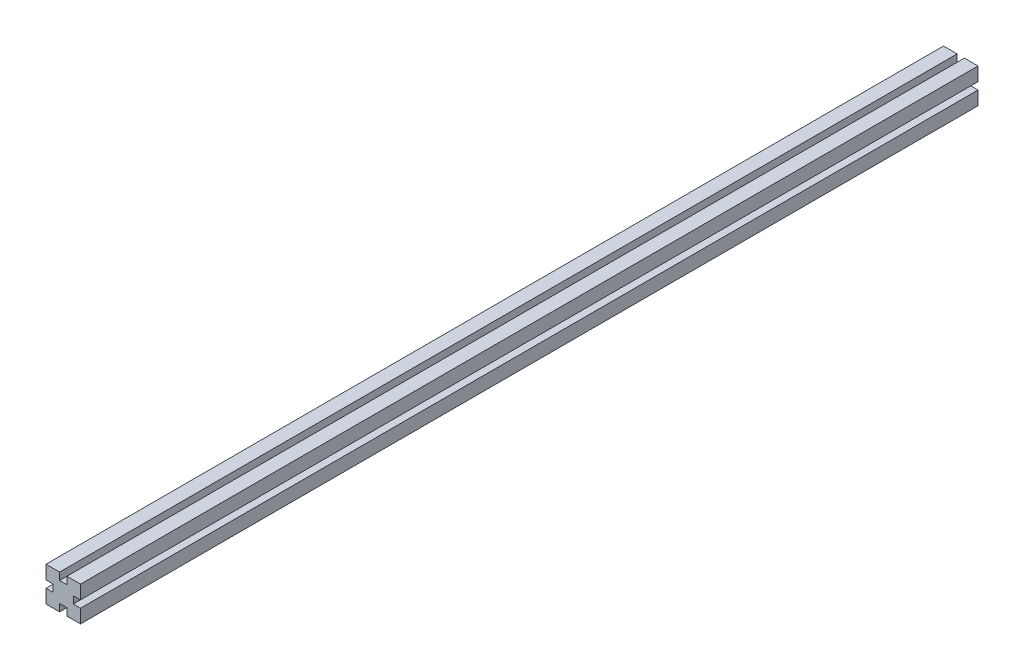
ISO-10303-21;
HEADER;
FILE_DESCRIPTION(('STEP AP214'),'2;1');
FILE_NAME('part.step','',(''),(''),'','','');
FILE_SCHEMA(('AUTOMOTIVE_DESIGN { 1 0 10303 214 1 1 1 1 }'));
ENDSEC;
DATA;
#1=APPLICATION_CONTEXT('core data for automotive mechanical design processes');
#2=APPLICATION_PROTOCOL_DEFINITION('international standard','automotive_design',2000,#1);
#3=PRODUCT_CONTEXT('',#1,'mechanical');
#4=PRODUCT('Part','Part','',(#3));
#5=PRODUCT_RELATED_PRODUCT_CATEGORY('part','',(#4));
#6=PRODUCT_DEFINITION_FORMATION('','',#4);
#7=PRODUCT_DEFINITION_CONTEXT('part definition',#1,'design');
#8=PRODUCT_DEFINITION('design','',#6,#7);
#9=PRODUCT_DEFINITION_SHAPE('','',#8);
#10=(LENGTH_UNIT() NAMED_UNIT(*) SI_UNIT(.MILLI.,.METRE.));
#11=(NAMED_UNIT(*) PLANE_ANGLE_UNIT() SI_UNIT($,.RADIAN.));
#12=(NAMED_UNIT(*) SI_UNIT($,.STERADIAN.) SOLID_ANGLE_UNIT());
#13=UNCERTAINTY_MEASURE_WITH_UNIT(LENGTH_MEASURE(1.E-05),#10,'distance_accuracy_value','');
#14=(GEOMETRIC_REPRESENTATION_CONTEXT(3) GLOBAL_UNCERTAINTY_ASSIGNED_CONTEXT((#13)) GLOBAL_UNIT_ASSIGNED_CONTEXT((#10,
#11,#12)) REPRESENTATION_CONTEXT('',''));
#15=CARTESIAN_POINT('',(0.,0.,0.));
#16=DIRECTION('',(0.,0.,1.));
#17=DIRECTION('',(1.,0.,0.));
#18=AXIS2_PLACEMENT_3D('',#15,#16,#17);
#19=CARTESIAN_POINT('',(-19.05,-4.,991.11));
#20=DIRECTION('',(1.,0.,0.));
#21=DIRECTION('',(0.,0.,-1.));
#22=AXIS2_PLACEMENT_3D('',#19,#20,#21);
#23=PLANE('',#22);
#24=DIRECTION('',(0.,-1.,0.));
#25=VECTOR('',#24,1.);
#26=CARTESIAN_POINT('',(-19.05,-4.,0.));
#27=LINE('',#26,#25);
#28=CARTESIAN_POINT('',(-19.05,-4.,0.));
#29=VERTEX_POINT('',#28);
#30=CARTESIAN_POINT('',(-19.05,-19.05,0.));
#31=VERTEX_POINT('',#30);
#32=EDGE_CURVE('E207',#29,#31,#27,.T.);
#33=ORIENTED_EDGE('',*,*,#32,.T.);
#34=DIRECTION('',(0.,0.,-1.));
#35=VECTOR('',#34,1.);
#36=CARTESIAN_POINT('',(-19.05,-19.05,991.11));
#37=LINE('',#36,#35);
#38=CARTESIAN_POINT('',(-19.05,-19.05,991.11));
#39=VERTEX_POINT('',#38);
#40=EDGE_CURVE('E11',#39,#31,#37,.T.);
#41=ORIENTED_EDGE('',*,*,#40,.F.);
#42=DIRECTION('',(0.,-1.,0.));
#43=VECTOR('',#42,1.);
#44=CARTESIAN_POINT('',(-19.05,-4.,991.11));
#45=LINE('',#44,#43);
#46=CARTESIAN_POINT('',(-19.05,-4.,991.11));
#47=VERTEX_POINT('',#46);
#48=EDGE_CURVE('E245',#47,#39,#45,.T.);
#49=ORIENTED_EDGE('',*,*,#48,.F.);
#50=DIRECTION('',(0.,0.,-1.));
#51=VECTOR('',#50,1.);
#52=CARTESIAN_POINT('',(-19.05,-4.,991.11));
#53=LINE('',#52,#51);
#54=EDGE_CURVE('E203',#47,#29,#53,.T.);
#55=ORIENTED_EDGE('',*,*,#54,.T.);
#56=EDGE_LOOP('',(#33,#41,#49,#55));
#57=FACE_BOUND('',#56,.T.);
#58=ADVANCED_FACE('F39',(#57),#23,.F.);
#59=CARTESIAN_POINT('',(-19.05,-19.05,991.11));
#60=DIRECTION('',(0.,1.,0.));
#61=DIRECTION('',(0.,0.,1.));
#62=AXIS2_PLACEMENT_3D('',#59,#60,#61);
#63=PLANE('',#62);
#64=DIRECTION('',(1.,0.,0.));
#65=VECTOR('',#64,1.);
#66=CARTESIAN_POINT('',(-19.05,-19.05,0.));
#67=LINE('',#66,#65);
#68=CARTESIAN_POINT('',(-4.,-19.05,0.));
#69=VERTEX_POINT('',#68);
#70=EDGE_CURVE('E210',#31,#69,#67,.T.);
#71=ORIENTED_EDGE('',*,*,#70,.T.);
#72=DIRECTION('',(0.,0.,-1.));
#73=VECTOR('',#72,1.);
#74=CARTESIAN_POINT('',(-4.,-19.05,991.11));
#75=LINE('',#74,#73);
#76=CARTESIAN_POINT('',(-4.,-19.05,991.11));
#77=VERTEX_POINT('',#76);
#78=EDGE_CURVE('E47',#77,#69,#75,.T.);
#79=ORIENTED_EDGE('',*,*,#78,.F.);
#80=DIRECTION('',(1.,0.,0.));
#81=VECTOR('',#80,1.);
#82=CARTESIAN_POINT('',(-19.05,-19.05,991.11));
#83=LINE('',#82,#81);
#84=EDGE_CURVE('E134',#39,#77,#83,.T.);
#85=ORIENTED_EDGE('',*,*,#84,.F.);
#86=ORIENTED_EDGE('',*,*,#40,.T.);
#87=EDGE_LOOP('',(#71,#79,#85,#86));
#88=FACE_BOUND('',#87,.T.);
#89=ADVANCED_FACE('F363',(#88),#63,.F.);
#90=CARTESIAN_POINT('',(-4.,-19.05,991.11));
#91=DIRECTION('',(-1.,0.,0.));
#92=DIRECTION('',(0.,0.,1.));
#93=AXIS2_PLACEMENT_3D('',#90,#91,#92);
#94=PLANE('',#93);
#95=DIRECTION('',(0.,1.,0.));
#96=VECTOR('',#95,1.);
#97=CARTESIAN_POINT('',(-4.,-19.05,0.));
#98=LINE('',#97,#96);
#99=CARTESIAN_POINT('',(-4.,-11.05,0.));
#100=VERTEX_POINT('',#99);
#101=EDGE_CURVE('E212',#69,#100,#98,.T.);
#102=ORIENTED_EDGE('',*,*,#101,.T.);
#103=DIRECTION('',(0.,0.,-1.));
#104=VECTOR('',#103,1.);
#105=CARTESIAN_POINT('',(-4.,-11.05,991.11));
#106=LINE('',#105,#104);
#107=CARTESIAN_POINT('',(-4.,-11.05,991.11));
#108=VERTEX_POINT('',#107);
#109=EDGE_CURVE('E288',#108,#100,#106,.T.);
#110=ORIENTED_EDGE('',*,*,#109,.F.);
#111=DIRECTION('',(0.,1.,0.));
#112=VECTOR('',#111,1.);
#113=CARTESIAN_POINT('',(-4.,-19.05,991.11));
#114=LINE('',#113,#112);
#115=EDGE_CURVE('E296',#77,#108,#114,.T.);
#116=ORIENTED_EDGE('',*,*,#115,.F.);
#117=ORIENTED_EDGE('',*,*,#78,.T.);
#118=EDGE_LOOP('',(#102,#110,#116,#117));
#119=FACE_BOUND('',#118,.T.);
#120=ADVANCED_FACE('F294',(#119),#94,.F.);
#121=CARTESIAN_POINT('',(-4.,-11.05,991.11));
#122=DIRECTION('',(0.,1.,0.));
#123=DIRECTION('',(0.,0.,1.));
#124=AXIS2_PLACEMENT_3D('',#121,#122,#123);
#125=PLANE('',#124);
#126=DIRECTION('',(1.,0.,0.));
#127=VECTOR('',#126,1.);
#128=CARTESIAN_POINT('',(-4.,-11.05,0.));
#129=LINE('',#128,#127);
#130=CARTESIAN_POINT('',(4.,-11.05,0.));
#131=VERTEX_POINT('',#130);
#132=EDGE_CURVE('E214',#100,#131,#129,.T.);
#133=ORIENTED_EDGE('',*,*,#132,.T.);
#134=DIRECTION('',(0.,0.,-1.));
#135=VECTOR('',#134,1.);
#136=CARTESIAN_POINT('',(4.,-11.05,991.11));
#137=LINE('',#136,#135);
#138=CARTESIAN_POINT('',(4.,-11.05,991.11));
#139=VERTEX_POINT('',#138);
#140=EDGE_CURVE('E285',#139,#131,#137,.T.);
#141=ORIENTED_EDGE('',*,*,#140,.F.);
#142=DIRECTION('',(1.,0.,0.));
#143=VECTOR('',#142,1.);
#144=CARTESIAN_POINT('',(-4.,-11.05,991.11));
#145=LINE('',#144,#143);
#146=EDGE_CURVE('E314',#108,#139,#145,.T.);
#147=ORIENTED_EDGE('',*,*,#146,.F.);
#148=ORIENTED_EDGE('',*,*,#109,.T.);
#149=EDGE_LOOP('',(#133,#141,#147,#148));
#150=FACE_BOUND('',#149,.T.);
#151=ADVANCED_FACE('F305',(#150),#125,.F.);
#152=CARTESIAN_POINT('',(4.,-11.05,991.11));
#153=DIRECTION('',(1.,0.,0.));
#154=DIRECTION('',(0.,0.,-1.));
#155=AXIS2_PLACEMENT_3D('',#152,#153,#154);
#156=PLANE('',#155);
#157=DIRECTION('',(0.,-1.,0.));
#158=VECTOR('',#157,1.);
#159=CARTESIAN_POINT('',(4.,-11.05,0.));
#160=LINE('',#159,#158);
#161=CARTESIAN_POINT('',(4.,-19.05,0.));
#162=VERTEX_POINT('',#161);
#163=EDGE_CURVE('E216',#131,#162,#160,.T.);
#164=ORIENTED_EDGE('',*,*,#163,.T.);
#165=DIRECTION('',(0.,0.,-1.));
#166=VECTOR('',#165,1.);
#167=CARTESIAN_POINT('',(4.,-19.05,991.11));
#168=LINE('',#167,#166);
#169=CARTESIAN_POINT('',(4.,-19.05,991.11));
#170=VERTEX_POINT('',#169);
#171=EDGE_CURVE('E282',#170,#162,#168,.T.);
#172=ORIENTED_EDGE('',*,*,#171,.F.);
#173=DIRECTION('',(0.,-1.,0.));
#174=VECTOR('',#173,1.);
#175=CARTESIAN_POINT('',(4.,-11.05,991.11));
#176=LINE('',#175,#174);
#177=EDGE_CURVE('E311',#139,#170,#176,.T.);
#178=ORIENTED_EDGE('',*,*,#177,.F.);
#179=ORIENTED_EDGE('',*,*,#140,.T.);
#180=EDGE_LOOP('',(#164,#172,#178,#179));
#181=FACE_BOUND('',#180,.T.);
#182=ADVANCED_FACE('F309',(#181),#156,.F.);
#183=CARTESIAN_POINT('',(4.,-19.05,991.11));
#184=DIRECTION('',(0.,1.,0.));
#185=DIRECTION('',(0.,0.,1.));
#186=AXIS2_PLACEMENT_3D('',#183,#184,#185);
#187=PLANE('',#186);
#188=DIRECTION('',(1.,0.,0.));
#189=VECTOR('',#188,1.);
#190=CARTESIAN_POINT('',(4.,-19.05,0.));
#191=LINE('',#190,#189);
#192=CARTESIAN_POINT('',(19.05,-19.05,0.));
#193=VERTEX_POINT('',#192);
#194=EDGE_CURVE('E218',#162,#193,#191,.T.);
#195=ORIENTED_EDGE('',*,*,#194,.T.);
#196=DIRECTION('',(0.,0.,-1.));
#197=VECTOR('',#196,1.);
#198=CARTESIAN_POINT('',(19.05,-19.05,991.11));
#199=LINE('',#198,#197);
#200=CARTESIAN_POINT('',(19.05,-19.05,991.11));
#201=VERTEX_POINT('',#200);
#202=EDGE_CURVE('E279',#201,#193,#199,.T.);
#203=ORIENTED_EDGE('',*,*,#202,.F.);
#204=DIRECTION('',(1.,0.,0.));
#205=VECTOR('',#204,1.);
#206=CARTESIAN_POINT('',(4.,-19.05,991.11));
#207=LINE('',#206,#205);
#208=EDGE_CURVE('E313',#170,#201,#207,.T.);
#209=ORIENTED_EDGE('',*,*,#208,.F.);
#210=ORIENTED_EDGE('',*,*,#171,.T.);
#211=EDGE_LOOP('',(#195,#203,#209,#210));
#212=FACE_BOUND('',#211,.T.);
#213=ADVANCED_FACE('F376',(#212),#187,.F.);
#214=CARTESIAN_POINT('',(19.05,-19.05,991.11));
#215=DIRECTION('',(-1.,0.,0.));
#216=DIRECTION('',(0.,0.,1.));
#217=AXIS2_PLACEMENT_3D('',#214,#215,#216);
#218=PLANE('',#217);
#219=DIRECTION('',(0.,1.,0.));
#220=VECTOR('',#219,1.);
#221=CARTESIAN_POINT('',(19.05,-19.05,0.));
#222=LINE('',#221,#220);
#223=CARTESIAN_POINT('',(19.05,-4.,0.));
#224=VERTEX_POINT('',#223);
#225=EDGE_CURVE('E220',#193,#224,#222,.T.);
#226=ORIENTED_EDGE('',*,*,#225,.T.);
#227=DIRECTION('',(0.,0.,-1.));
#228=VECTOR('',#227,1.);
#229=CARTESIAN_POINT('',(19.05,-4.,991.11));
#230=LINE('',#229,#228);
#231=CARTESIAN_POINT('',(19.05,-4.,991.11));
#232=VERTEX_POINT('',#231);
#233=EDGE_CURVE('E276',#232,#224,#230,.T.);
#234=ORIENTED_EDGE('',*,*,#233,.F.);
#235=DIRECTION('',(0.,1.,0.));
#236=VECTOR('',#235,1.);
#237=CARTESIAN_POINT('',(19.05,-19.05,991.11));
#238=LINE('',#237,#236);
#239=EDGE_CURVE('E316',#201,#232,#238,.T.);
#240=ORIENTED_EDGE('',*,*,#239,.F.);
#241=ORIENTED_EDGE('',*,*,#202,.T.);
#242=EDGE_LOOP('',(#226,#234,#240,#241));
#243=FACE_BOUND('',#242,.T.);
#244=ADVANCED_FACE('F379',(#243),#218,.F.);
#245=CARTESIAN_POINT('',(19.05,-4.,991.11));
#246=DIRECTION('',(0.,-1.,0.));
#247=DIRECTION('',(0.,0.,-1.));
#248=AXIS2_PLACEMENT_3D('',#245,#246,#247);
#249=PLANE('',#248);
#250=DIRECTION('',(-1.,0.,0.));
#251=VECTOR('',#250,1.);
#252=CARTESIAN_POINT('',(19.05,-4.,0.));
#253=LINE('',#252,#251);
#254=CARTESIAN_POINT('',(11.05,-4.,0.));
#255=VERTEX_POINT('',#254);
#256=EDGE_CURVE('E222',#224,#255,#253,.T.);
#257=ORIENTED_EDGE('',*,*,#256,.T.);
#258=DIRECTION('',(0.,0.,-1.));
#259=VECTOR('',#258,1.);
#260=CARTESIAN_POINT('',(11.05,-4.,991.11));
#261=LINE('',#260,#259);
#262=CARTESIAN_POINT('',(11.05,-4.,991.11));
#263=VERTEX_POINT('',#262);
#264=EDGE_CURVE('E273',#263,#255,#261,.T.);
#265=ORIENTED_EDGE('',*,*,#264,.F.);
#266=DIRECTION('',(-1.,0.,0.));
#267=VECTOR('',#266,1.);
#268=CARTESIAN_POINT('',(19.05,-4.,991.11));
#269=LINE('',#268,#267);
#270=EDGE_CURVE('E322',#232,#263,#269,.T.);
#271=ORIENTED_EDGE('',*,*,#270,.F.);
#272=ORIENTED_EDGE('',*,*,#233,.T.);
#273=EDGE_LOOP('',(#257,#265,#271,#272));
#274=FACE_BOUND('',#273,.T.);
#275=ADVANCED_FACE('F383',(#274),#249,.F.);
#276=CARTESIAN_POINT('',(11.05,-4.,991.11));
#277=DIRECTION('',(-1.,0.,0.));
#278=DIRECTION('',(0.,0.,1.));
#279=AXIS2_PLACEMENT_3D('',#276,#277,#278);
#280=PLANE('',#279);
#281=DIRECTION('',(0.,1.,0.));
#282=VECTOR('',#281,1.);
#283=CARTESIAN_POINT('',(11.05,-4.,0.));
#284=LINE('',#283,#282);
#285=CARTESIAN_POINT('',(11.05,4.,0.));
#286=VERTEX_POINT('',#285);
#287=EDGE_CURVE('E224',#255,#286,#284,.T.);
#288=ORIENTED_EDGE('',*,*,#287,.T.);
#289=DIRECTION('',(0.,0.,-1.));
#290=VECTOR('',#289,1.);
#291=CARTESIAN_POINT('',(11.05,4.,991.11));
#292=LINE('',#291,#290);
#293=CARTESIAN_POINT('',(11.05,4.,991.11));
#294=VERTEX_POINT('',#293);
#295=EDGE_CURVE('E270',#294,#286,#292,.T.);
#296=ORIENTED_EDGE('',*,*,#295,.F.);
#297=DIRECTION('',(0.,1.,0.));
#298=VECTOR('',#297,1.);
#299=CARTESIAN_POINT('',(11.05,-4.,991.11));
#300=LINE('',#299,#298);
#301=EDGE_CURVE('E324',#263,#294,#300,.T.);
#302=ORIENTED_EDGE('',*,*,#301,.F.);
#303=ORIENTED_EDGE('',*,*,#264,.T.);
#304=EDGE_LOOP('',(#288,#296,#302,#303));
#305=FACE_BOUND('',#304,.T.);
#306=ADVANCED_FACE('F387',(#305),#280,.F.);
#307=CARTESIAN_POINT('',(11.05,4.,991.11));
#308=DIRECTION('',(0.,1.,0.));
#309=DIRECTION('',(0.,0.,1.));
#310=AXIS2_PLACEMENT_3D('',#307,#308,#309);
#311=PLANE('',#310);
#312=DIRECTION('',(1.,0.,0.));
#313=VECTOR('',#312,1.);
#314=CARTESIAN_POINT('',(11.05,4.,0.));
#315=LINE('',#314,#313);
#316=CARTESIAN_POINT('',(19.05,4.,0.));
#317=VERTEX_POINT('',#316);
#318=EDGE_CURVE('E226',#286,#317,#315,.T.);
#319=ORIENTED_EDGE('',*,*,#318,.T.);
#320=DIRECTION('',(0.,0.,-1.));
#321=VECTOR('',#320,1.);
#322=CARTESIAN_POINT('',(19.05,4.,991.11));
#323=LINE('',#322,#321);
#324=CARTESIAN_POINT('',(19.05,4.,991.11));
#325=VERTEX_POINT('',#324);
#326=EDGE_CURVE('E267',#325,#317,#323,.T.);
#327=ORIENTED_EDGE('',*,*,#326,.F.);
#328=DIRECTION('',(1.,0.,0.));
#329=VECTOR('',#328,1.);
#330=CARTESIAN_POINT('',(11.05,4.,991.11));
#331=LINE('',#330,#329);
#332=EDGE_CURVE('E326',#294,#325,#331,.T.);
#333=ORIENTED_EDGE('',*,*,#332,.F.);
#334=ORIENTED_EDGE('',*,*,#295,.T.);
#335=EDGE_LOOP('',(#319,#327,#333,#334));
#336=FACE_BOUND('',#335,.T.);
#337=ADVANCED_FACE('F391',(#336),#311,.F.);
#338=CARTESIAN_POINT('',(19.05,4.,991.11));
#339=DIRECTION('',(-1.,0.,0.));
#340=DIRECTION('',(0.,0.,1.));
#341=AXIS2_PLACEMENT_3D('',#338,#339,#340);
#342=PLANE('',#341);
#343=DIRECTION('',(0.,1.,0.));
#344=VECTOR('',#343,1.);
#345=CARTESIAN_POINT('',(19.05,4.,0.));
#346=LINE('',#345,#344);
#347=CARTESIAN_POINT('',(19.05,19.05,0.));
#348=VERTEX_POINT('',#347);
#349=EDGE_CURVE('E228',#317,#348,#346,.T.);
#350=ORIENTED_EDGE('',*,*,#349,.T.);
#351=DIRECTION('',(0.,0.,-1.));
#352=VECTOR('',#351,1.);
#353=CARTESIAN_POINT('',(19.05,19.05,991.11));
#354=LINE('',#353,#352);
#355=CARTESIAN_POINT('',(19.05,19.05,991.11));
#356=VERTEX_POINT('',#355);
#357=EDGE_CURVE('E264',#356,#348,#354,.T.);
#358=ORIENTED_EDGE('',*,*,#357,.F.);
#359=DIRECTION('',(0.,1.,0.));
#360=VECTOR('',#359,1.);
#361=CARTESIAN_POINT('',(19.05,4.,991.11));
#362=LINE('',#361,#360);
#363=EDGE_CURVE('E328',#325,#356,#362,.T.);
#364=ORIENTED_EDGE('',*,*,#363,.F.);
#365=ORIENTED_EDGE('',*,*,#326,.T.);
#366=EDGE_LOOP('',(#350,#358,#364,#365));
#367=FACE_BOUND('',#366,.T.);
#368=ADVANCED_FACE('F395',(#367),#342,.F.);
#369=CARTESIAN_POINT('',(19.05,19.05,991.11));
#370=DIRECTION('',(0.,-1.,0.));
#371=DIRECTION('',(0.,0.,-1.));
#372=AXIS2_PLACEMENT_3D('',#369,#370,#371);
#373=PLANE('',#372);
#374=DIRECTION('',(-1.,0.,0.));
#375=VECTOR('',#374,1.);
#376=CARTESIAN_POINT('',(19.05,19.05,0.));
#377=LINE('',#376,#375);
#378=CARTESIAN_POINT('',(4.,19.05,0.));
#379=VERTEX_POINT('',#378);
#380=EDGE_CURVE('E230',#348,#379,#377,.T.);
#381=ORIENTED_EDGE('',*,*,#380,.T.);
#382=DIRECTION('',(0.,0.,-1.));
#383=VECTOR('',#382,1.);
#384=CARTESIAN_POINT('',(4.,19.05,991.11));
#385=LINE('',#384,#383);
#386=CARTESIAN_POINT('',(4.,19.05,991.11));
#387=VERTEX_POINT('',#386);
#388=EDGE_CURVE('E261',#387,#379,#385,.T.);
#389=ORIENTED_EDGE('',*,*,#388,.F.);
#390=DIRECTION('',(-1.,0.,0.));
#391=VECTOR('',#390,1.);
#392=CARTESIAN_POINT('',(19.05,19.05,991.11));
#393=LINE('',#392,#391);
#394=EDGE_CURVE('E330',#356,#387,#393,.T.);
#395=ORIENTED_EDGE('',*,*,#394,.F.);
#396=ORIENTED_EDGE('',*,*,#357,.T.);
#397=EDGE_LOOP('',(#381,#389,#395,#396));
#398=FACE_BOUND('',#397,.T.);
#399=ADVANCED_FACE('F399',(#398),#373,.F.);
#400=CARTESIAN_POINT('',(4.,19.05,991.11));
#401=DIRECTION('',(1.,0.,0.));
#402=DIRECTION('',(0.,0.,-1.));
#403=AXIS2_PLACEMENT_3D('',#400,#401,#402);
#404=PLANE('',#403);
#405=DIRECTION('',(0.,-1.,0.));
#406=VECTOR('',#405,1.);
#407=CARTESIAN_POINT('',(4.,19.05,0.));
#408=LINE('',#407,#406);
#409=CARTESIAN_POINT('',(4.,11.05,0.));
#410=VERTEX_POINT('',#409);
#411=EDGE_CURVE('E232',#379,#410,#408,.T.);
#412=ORIENTED_EDGE('',*,*,#411,.T.);
#413=DIRECTION('',(0.,0.,-1.));
#414=VECTOR('',#413,1.);
#415=CARTESIAN_POINT('',(4.,11.05,991.11));
#416=LINE('',#415,#414);
#417=CARTESIAN_POINT('',(4.,11.05,991.11));
#418=VERTEX_POINT('',#417);
#419=EDGE_CURVE('E258',#418,#410,#416,.T.);
#420=ORIENTED_EDGE('',*,*,#419,.F.);
#421=DIRECTION('',(0.,-1.,0.));
#422=VECTOR('',#421,1.);
#423=CARTESIAN_POINT('',(4.,19.05,991.11));
#424=LINE('',#423,#422);
#425=EDGE_CURVE('E332',#387,#418,#424,.T.);
#426=ORIENTED_EDGE('',*,*,#425,.F.);
#427=ORIENTED_EDGE('',*,*,#388,.T.);
#428=EDGE_LOOP('',(#412,#420,#426,#427));
#429=FACE_BOUND('',#428,.T.);
#430=ADVANCED_FACE('F403',(#429),#404,.F.);
#431=CARTESIAN_POINT('',(4.,11.05,991.11));
#432=DIRECTION('',(0.,-1.,0.));
#433=DIRECTION('',(0.,0.,-1.));
#434=AXIS2_PLACEMENT_3D('',#431,#432,#433);
#435=PLANE('',#434);
#436=DIRECTION('',(-1.,0.,0.));
#437=VECTOR('',#436,1.);
#438=CARTESIAN_POINT('',(4.,11.05,0.));
#439=LINE('',#438,#437);
#440=CARTESIAN_POINT('',(-4.,11.05,0.));
#441=VERTEX_POINT('',#440);
#442=EDGE_CURVE('E234',#410,#441,#439,.T.);
#443=ORIENTED_EDGE('',*,*,#442,.T.);
#444=DIRECTION('',(0.,0.,-1.));
#445=VECTOR('',#444,1.);
#446=CARTESIAN_POINT('',(-4.,11.05,991.11));
#447=LINE('',#446,#445);
#448=CARTESIAN_POINT('',(-4.,11.05,991.11));
#449=VERTEX_POINT('',#448);
#450=EDGE_CURVE('E255',#449,#441,#447,.T.);
#451=ORIENTED_EDGE('',*,*,#450,.F.);
#452=DIRECTION('',(-1.,0.,0.));
#453=VECTOR('',#452,1.);
#454=CARTESIAN_POINT('',(4.,11.05,991.11));
#455=LINE('',#454,#453);
#456=EDGE_CURVE('E334',#418,#449,#455,.T.);
#457=ORIENTED_EDGE('',*,*,#456,.F.);
#458=ORIENTED_EDGE('',*,*,#419,.T.);
#459=EDGE_LOOP('',(#443,#451,#457,#458));
#460=FACE_BOUND('',#459,.T.);
#461=ADVANCED_FACE('F407',(#460),#435,.F.);
#462=CARTESIAN_POINT('',(-4.,11.05,991.11));
#463=DIRECTION('',(-1.,0.,0.));
#464=DIRECTION('',(0.,0.,1.));
#465=AXIS2_PLACEMENT_3D('',#462,#463,#464);
#466=PLANE('',#465);
#467=DIRECTION('',(0.,1.,0.));
#468=VECTOR('',#467,1.);
#469=CARTESIAN_POINT('',(-4.,11.05,0.));
#470=LINE('',#469,#468);
#471=CARTESIAN_POINT('',(-4.,19.05,0.));
#472=VERTEX_POINT('',#471);
#473=EDGE_CURVE('E236',#441,#472,#470,.T.);
#474=ORIENTED_EDGE('',*,*,#473,.T.);
#475=DIRECTION('',(0.,0.,-1.));
#476=VECTOR('',#475,1.);
#477=CARTESIAN_POINT('',(-4.,19.05,991.11));
#478=LINE('',#477,#476);
#479=CARTESIAN_POINT('',(-4.,19.05,991.11));
#480=VERTEX_POINT('',#479);
#481=EDGE_CURVE('E252',#480,#472,#478,.T.);
#482=ORIENTED_EDGE('',*,*,#481,.F.);
#483=DIRECTION('',(0.,1.,0.));
#484=VECTOR('',#483,1.);
#485=CARTESIAN_POINT('',(-4.,11.05,991.11));
#486=LINE('',#485,#484);
#487=EDGE_CURVE('E336',#449,#480,#486,.T.);
#488=ORIENTED_EDGE('',*,*,#487,.F.);
#489=ORIENTED_EDGE('',*,*,#450,.T.);
#490=EDGE_LOOP('',(#474,#482,#488,#489));
#491=FACE_BOUND('',#490,.T.);
#492=ADVANCED_FACE('F411',(#491),#466,.F.);
#493=CARTESIAN_POINT('',(-4.,19.05,991.11));
#494=DIRECTION('',(0.,-1.,0.));
#495=DIRECTION('',(0.,0.,-1.));
#496=AXIS2_PLACEMENT_3D('',#493,#494,#495);
#497=PLANE('',#496);
#498=DIRECTION('',(-1.,0.,0.));
#499=VECTOR('',#498,1.);
#500=CARTESIAN_POINT('',(-4.,19.05,0.));
#501=LINE('',#500,#499);
#502=CARTESIAN_POINT('',(-19.05,19.05,0.));
#503=VERTEX_POINT('',#502);
#504=EDGE_CURVE('E238',#472,#503,#501,.T.);
#505=ORIENTED_EDGE('',*,*,#504,.T.);
#506=DIRECTION('',(0.,0.,-1.));
#507=VECTOR('',#506,1.);
#508=CARTESIAN_POINT('',(-19.05,19.05,991.11));
#509=LINE('',#508,#507);
#510=CARTESIAN_POINT('',(-19.05,19.05,991.11));
#511=VERTEX_POINT('',#510);
#512=EDGE_CURVE('E249',#511,#503,#509,.T.);
#513=ORIENTED_EDGE('',*,*,#512,.F.);
#514=DIRECTION('',(-1.,0.,0.));
#515=VECTOR('',#514,1.);
#516=CARTESIAN_POINT('',(-4.,19.05,991.11));
#517=LINE('',#516,#515);
#518=EDGE_CURVE('E338',#480,#511,#517,.T.);
#519=ORIENTED_EDGE('',*,*,#518,.F.);
#520=ORIENTED_EDGE('',*,*,#481,.T.);
#521=EDGE_LOOP('',(#505,#513,#519,#520));
#522=FACE_BOUND('',#521,.T.);
#523=ADVANCED_FACE('F344',(#522),#497,.F.);
#524=CARTESIAN_POINT('',(-19.05,19.05,991.11));
#525=DIRECTION('',(1.,0.,0.));
#526=DIRECTION('',(0.,0.,-1.));
#527=AXIS2_PLACEMENT_3D('',#524,#525,#526);
#528=PLANE('',#527);
#529=DIRECTION('',(0.,-1.,0.));
#530=VECTOR('',#529,1.);
#531=CARTESIAN_POINT('',(-19.05,19.05,0.));
#532=LINE('',#531,#530);
#533=CARTESIAN_POINT('',(-19.05,4.,0.));
#534=VERTEX_POINT('',#533);
#535=EDGE_CURVE('E240',#503,#534,#532,.T.);
#536=ORIENTED_EDGE('',*,*,#535,.T.);
#537=DIRECTION('',(0.,0.,-1.));
#538=VECTOR('',#537,1.);
#539=CARTESIAN_POINT('',(-19.05,4.,991.11));
#540=LINE('',#539,#538);
#541=CARTESIAN_POINT('',(-19.05,4.,991.11));
#542=VERTEX_POINT('',#541);
#543=EDGE_CURVE('E198',#542,#534,#540,.T.);
#544=ORIENTED_EDGE('',*,*,#543,.F.);
#545=DIRECTION('',(0.,-1.,0.));
#546=VECTOR('',#545,1.);
#547=CARTESIAN_POINT('',(-19.05,19.05,991.11));
#548=LINE('',#547,#546);
#549=EDGE_CURVE('E189',#511,#542,#548,.T.);
#550=ORIENTED_EDGE('',*,*,#549,.F.);
#551=ORIENTED_EDGE('',*,*,#512,.T.);
#552=EDGE_LOOP('',(#536,#544,#550,#551));
#553=FACE_BOUND('',#552,.T.);
#554=ADVANCED_FACE('F348',(#553),#528,.F.);
#555=CARTESIAN_POINT('',(-19.05,4.,991.11));
#556=DIRECTION('',(0.,1.,0.));
#557=DIRECTION('',(0.,0.,1.));
#558=AXIS2_PLACEMENT_3D('',#555,#556,#557);
#559=PLANE('',#558);
#560=DIRECTION('',(1.,0.,0.));
#561=VECTOR('',#560,1.);
#562=CARTESIAN_POINT('',(-19.05,4.,0.));
#563=LINE('',#562,#561);
#564=CARTESIAN_POINT('',(-11.05,4.,0.));
#565=VERTEX_POINT('',#564);
#566=EDGE_CURVE('E197',#534,#565,#563,.T.);
#567=ORIENTED_EDGE('',*,*,#566,.T.);
#568=DIRECTION('',(0.,0.,-1.));
#569=VECTOR('',#568,1.);
#570=CARTESIAN_POINT('',(-11.05,4.,991.11));
#571=LINE('',#570,#569);
#572=CARTESIAN_POINT('',(-11.05,4.,991.11));
#573=VERTEX_POINT('',#572);
#574=EDGE_CURVE('E194',#573,#565,#571,.T.);
#575=ORIENTED_EDGE('',*,*,#574,.F.);
#576=DIRECTION('',(1.,0.,0.));
#577=VECTOR('',#576,1.);
#578=CARTESIAN_POINT('',(-19.05,4.,991.11));
#579=LINE('',#578,#577);
#580=EDGE_CURVE('E183',#542,#573,#579,.T.);
#581=ORIENTED_EDGE('',*,*,#580,.F.);
#582=ORIENTED_EDGE('',*,*,#543,.T.);
#583=EDGE_LOOP('',(#567,#575,#581,#582));
#584=FACE_BOUND('',#583,.T.);
#585=ADVANCED_FACE('F195',(#584),#559,.F.);
#586=CARTESIAN_POINT('',(-11.05,4.,991.11));
#587=DIRECTION('',(1.,0.,0.));
#588=DIRECTION('',(0.,0.,-1.));
#589=AXIS2_PLACEMENT_3D('',#586,#587,#588);
#590=PLANE('',#589);
#591=DIRECTION('',(0.,-1.,0.));
#592=VECTOR('',#591,1.);
#593=CARTESIAN_POINT('',(-11.05,4.,0.));
#594=LINE('',#593,#592);
#595=CARTESIAN_POINT('',(-11.05,-4.,0.));
#596=VERTEX_POINT('',#595);
#597=EDGE_CURVE('E120',#565,#596,#594,.T.);
#598=ORIENTED_EDGE('',*,*,#597,.T.);
#599=DIRECTION('',(0.,0.,-1.));
#600=VECTOR('',#599,1.);
#601=CARTESIAN_POINT('',(-11.05,-4.,991.11));
#602=LINE('',#601,#600);
#603=CARTESIAN_POINT('',(-11.05,-4.,991.11));
#604=VERTEX_POINT('',#603);
#605=EDGE_CURVE('E199',#604,#596,#602,.T.);
#606=ORIENTED_EDGE('',*,*,#605,.F.);
#607=DIRECTION('',(0.,-1.,0.));
#608=VECTOR('',#607,1.);
#609=CARTESIAN_POINT('',(-11.05,4.,991.11));
#610=LINE('',#609,#608);
#611=EDGE_CURVE('E187',#573,#604,#610,.T.);
#612=ORIENTED_EDGE('',*,*,#611,.F.);
#613=ORIENTED_EDGE('',*,*,#574,.T.);
#614=EDGE_LOOP('',(#598,#606,#612,#613));
#615=FACE_BOUND('',#614,.T.);
#616=ADVANCED_FACE('F201',(#615),#590,.F.);
#617=CARTESIAN_POINT('',(-11.05,-4.,991.11));
#618=DIRECTION('',(0.,-1.,0.));
#619=DIRECTION('',(0.,0.,-1.));
#620=AXIS2_PLACEMENT_3D('',#617,#618,#619);
#621=PLANE('',#620);
#622=DIRECTION('',(-1.,0.,0.));
#623=VECTOR('',#622,1.);
#624=CARTESIAN_POINT('',(-11.05,-4.,0.));
#625=LINE('',#624,#623);
#626=EDGE_CURVE('E126',#596,#29,#625,.T.);
#627=ORIENTED_EDGE('',*,*,#626,.T.);
#628=ORIENTED_EDGE('',*,*,#54,.F.);
#629=DIRECTION('',(-1.,0.,0.));
#630=VECTOR('',#629,1.);
#631=CARTESIAN_POINT('',(-11.05,-4.,991.11));
#632=LINE('',#631,#630);
#633=EDGE_CURVE('E55',#604,#47,#632,.T.);
#634=ORIENTED_EDGE('',*,*,#633,.F.);
#635=ORIENTED_EDGE('',*,*,#605,.T.);
#636=EDGE_LOOP('',(#627,#628,#634,#635));
#637=FACE_BOUND('',#636,.T.);
#638=ADVANCED_FACE('F352',(#637),#621,.F.);
#639=CARTESIAN_POINT('',(0.,0.,991.11));
#640=DIRECTION('',(0.,0.,1.));
#641=DIRECTION('',(1.,0.,0.));
#642=AXIS2_PLACEMENT_3D('',#639,#640,#641);
#643=PLANE('',#642);
#644=ORIENTED_EDGE('',*,*,#48,.T.);
#645=ORIENTED_EDGE('',*,*,#84,.T.);
#646=ORIENTED_EDGE('',*,*,#115,.T.);
#647=ORIENTED_EDGE('',*,*,#146,.T.);
#648=ORIENTED_EDGE('',*,*,#177,.T.);
#649=ORIENTED_EDGE('',*,*,#208,.T.);
#650=ORIENTED_EDGE('',*,*,#239,.T.);
#651=ORIENTED_EDGE('',*,*,#270,.T.);
#652=ORIENTED_EDGE('',*,*,#301,.T.);
#653=ORIENTED_EDGE('',*,*,#332,.T.);
#654=ORIENTED_EDGE('',*,*,#363,.T.);
#655=ORIENTED_EDGE('',*,*,#394,.T.);
#656=ORIENTED_EDGE('',*,*,#425,.T.);
#657=ORIENTED_EDGE('',*,*,#456,.T.);
#658=ORIENTED_EDGE('',*,*,#487,.T.);
#659=ORIENTED_EDGE('',*,*,#518,.T.);
#660=ORIENTED_EDGE('',*,*,#549,.T.);
#661=ORIENTED_EDGE('',*,*,#580,.T.);
#662=ORIENTED_EDGE('',*,*,#611,.T.);
#663=ORIENTED_EDGE('',*,*,#633,.T.);
#664=EDGE_LOOP('',(#644,#645,#646,#647,#648,#649,#650,#651,#652,#653,#654,#655,#656,#657,#658,
#659,#660,#661,#662,#663));
#665=FACE_BOUND('',#664,.T.);
#666=ADVANCED_FACE('F185',(#665),#643,.T.);
#667=CARTESIAN_POINT('',(0.,0.,0.));
#668=DIRECTION('',(0.,0.,1.));
#669=DIRECTION('',(1.,0.,0.));
#670=AXIS2_PLACEMENT_3D('',#667,#668,#669);
#671=PLANE('',#670);
#672=ORIENTED_EDGE('',*,*,#32,.F.);
#673=ORIENTED_EDGE('',*,*,#626,.F.);
#674=ORIENTED_EDGE('',*,*,#597,.F.);
#675=ORIENTED_EDGE('',*,*,#566,.F.);
#676=ORIENTED_EDGE('',*,*,#535,.F.);
#677=ORIENTED_EDGE('',*,*,#504,.F.);
#678=ORIENTED_EDGE('',*,*,#473,.F.);
#679=ORIENTED_EDGE('',*,*,#442,.F.);
#680=ORIENTED_EDGE('',*,*,#411,.F.);
#681=ORIENTED_EDGE('',*,*,#380,.F.);
#682=ORIENTED_EDGE('',*,*,#349,.F.);
#683=ORIENTED_EDGE('',*,*,#318,.F.);
#684=ORIENTED_EDGE('',*,*,#287,.F.);
#685=ORIENTED_EDGE('',*,*,#256,.F.);
#686=ORIENTED_EDGE('',*,*,#225,.F.);
#687=ORIENTED_EDGE('',*,*,#194,.F.);
#688=ORIENTED_EDGE('',*,*,#163,.F.);
#689=ORIENTED_EDGE('',*,*,#132,.F.);
#690=ORIENTED_EDGE('',*,*,#101,.F.);
#691=ORIENTED_EDGE('',*,*,#70,.F.);
#692=EDGE_LOOP('',(#672,#673,#674,#675,#676,#677,#678,#679,#680,#681,#682,#683,#684,#685,#686,
#687,#688,#689,#690,#691));
#693=FACE_BOUND('',#692,.T.);
#694=ADVANCED_FACE('F300',(#693),#671,.F.);
#695=CLOSED_SHELL('',(#58,#89,#120,#151,#182,#213,#244,#275,#306,#337,#368,#399,#430,#461,#492,
#523,#554,#585,#616,#638,#666,#694));
#696=MANIFOLD_SOLID_BREP('B2',#695);
#697=ADVANCED_BREP_SHAPE_REPRESENTATION('',(#18,#696),#14);
#698=SHAPE_DEFINITION_REPRESENTATION(#9,#697);
ENDSEC;
END-ISO-10303-21;
